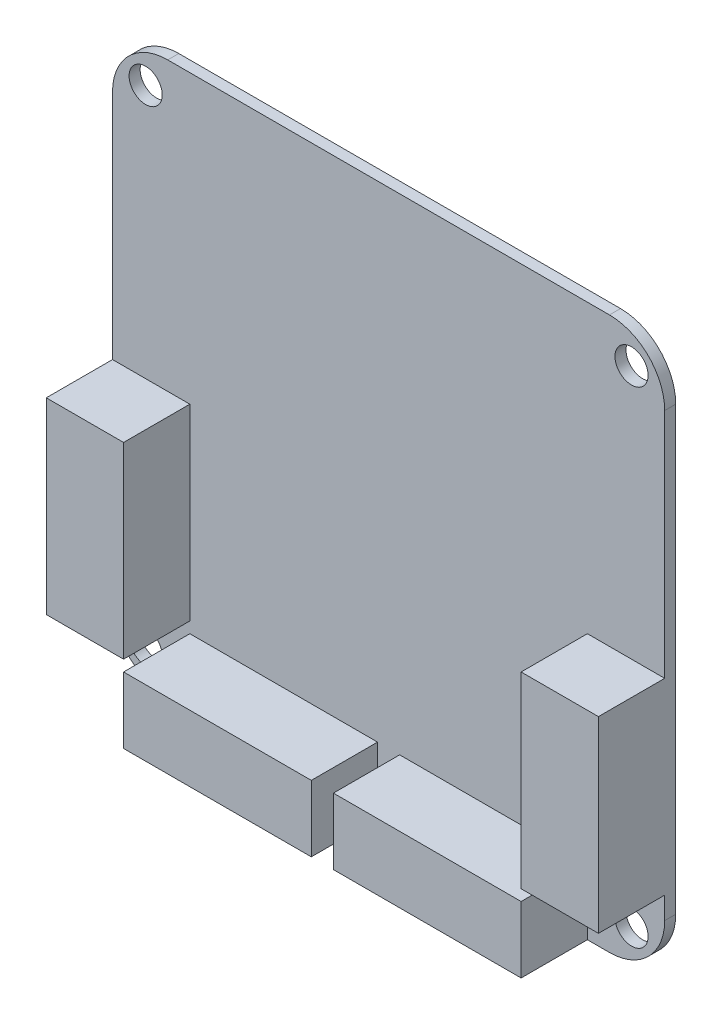
ISO-10303-21;
HEADER;
FILE_DESCRIPTION(('STEP AP214'),'2;1');
FILE_NAME('part.step','',(''),(''),'','','');
FILE_SCHEMA(('AUTOMOTIVE_DESIGN { 1 0 10303 214 1 1 1 1 }'));
ENDSEC;
DATA;
#1=APPLICATION_CONTEXT('core data for automotive mechanical design processes');
#2=APPLICATION_PROTOCOL_DEFINITION('international standard','automotive_design',2000,#1);
#3=PRODUCT_CONTEXT('',#1,'mechanical');
#4=PRODUCT('Part','Part','',(#3));
#5=PRODUCT_RELATED_PRODUCT_CATEGORY('part','',(#4));
#6=PRODUCT_DEFINITION_FORMATION('','',#4);
#7=PRODUCT_DEFINITION_CONTEXT('part definition',#1,'design');
#8=PRODUCT_DEFINITION('design','',#6,#7);
#9=PRODUCT_DEFINITION_SHAPE('','',#8);
#10=(LENGTH_UNIT() NAMED_UNIT(*) SI_UNIT(.MILLI.,.METRE.));
#11=(NAMED_UNIT(*) PLANE_ANGLE_UNIT() SI_UNIT($,.RADIAN.));
#12=(NAMED_UNIT(*) SI_UNIT($,.STERADIAN.) SOLID_ANGLE_UNIT());
#13=UNCERTAINTY_MEASURE_WITH_UNIT(LENGTH_MEASURE(1.E-05),#10,'distance_accuracy_value','');
#14=(GEOMETRIC_REPRESENTATION_CONTEXT(3) GLOBAL_UNCERTAINTY_ASSIGNED_CONTEXT((#13)) GLOBAL_UNIT_ASSIGNED_CONTEXT((#10,
#11,#12)) REPRESENTATION_CONTEXT('',''));
#15=CARTESIAN_POINT('',(0.,0.,0.));
#16=DIRECTION('',(0.,0.,1.));
#17=DIRECTION('',(1.,0.,0.));
#18=AXIS2_PLACEMENT_3D('',#15,#16,#17);
#19=CARTESIAN_POINT('',(0.,0.,1.));
#20=DIRECTION('',(0.,0.,1.));
#21=DIRECTION('',(1.,0.,0.));
#22=AXIS2_PLACEMENT_3D('',#19,#20,#21);
#23=PLANE('',#22);
#24=CARTESIAN_POINT('',(22.,22.,1.));
#25=DIRECTION('',(0.,0.,1.));
#26=DIRECTION('',(1.,0.,0.));
#27=AXIS2_PLACEMENT_3D('',#24,#25,#26);
#28=CIRCLE('',#27,1.5);
#29=CARTESIAN_POINT('',(23.5,22.,1.));
#30=VERTEX_POINT('',#29);
#31=EDGE_CURVE('E818',#30,#30,#28,.T.);
#32=ORIENTED_EDGE('',*,*,#31,.F.);
#33=EDGE_LOOP('',(#32));
#34=FACE_BOUND('',#33,.T.);
#35=CARTESIAN_POINT('',(-22.,-22.,1.));
#36=DIRECTION('',(0.,0.,1.));
#37=DIRECTION('',(1.,0.,0.));
#38=AXIS2_PLACEMENT_3D('',#35,#36,#37);
#39=CIRCLE('',#38,1.5);
#40=CARTESIAN_POINT('',(-20.5,-22.,1.));
#41=VERTEX_POINT('',#40);
#42=EDGE_CURVE('E820',#41,#41,#39,.T.);
#43=ORIENTED_EDGE('',*,*,#42,.F.);
#44=EDGE_LOOP('',(#43));
#45=FACE_BOUND('',#44,.T.);
#46=CARTESIAN_POINT('',(22.,-22.,1.));
#47=DIRECTION('',(0.,0.,1.));
#48=DIRECTION('',(1.,0.,0.));
#49=AXIS2_PLACEMENT_3D('',#46,#47,#48);
#50=CIRCLE('',#49,1.5);
#51=CARTESIAN_POINT('',(23.5,-22.,1.));
#52=VERTEX_POINT('',#51);
#53=EDGE_CURVE('E822',#52,#52,#50,.T.);
#54=ORIENTED_EDGE('',*,*,#53,.F.);
#55=EDGE_LOOP('',(#54));
#56=FACE_BOUND('',#55,.T.);
#57=CARTESIAN_POINT('',(-22.,22.,1.));
#58=DIRECTION('',(0.,0.,1.));
#59=DIRECTION('',(1.,0.,0.));
#60=AXIS2_PLACEMENT_3D('',#57,#58,#59);
#61=CIRCLE('',#60,1.5);
#62=CARTESIAN_POINT('',(-20.5,22.,1.));
#63=VERTEX_POINT('',#62);
#64=EDGE_CURVE('E230',#63,#63,#61,.T.);
#65=ORIENTED_EDGE('',*,*,#64,.F.);
#66=EDGE_LOOP('',(#65));
#67=FACE_BOUND('',#66,.T.);
#68=DIRECTION('',(0.,-1.,0.));
#69=VECTOR('',#68,1.);
#70=CARTESIAN_POINT('',(18.,-18.,1.));
#71=LINE('',#70,#69);
#72=CARTESIAN_POINT('',(18.,-1.00000000000001,1.));
#73=VERTEX_POINT('',#72);
#74=CARTESIAN_POINT('',(18.,-18.,1.));
#75=VERTEX_POINT('',#74);
#76=EDGE_CURVE('E56',#73,#75,#71,.T.);
#77=ORIENTED_EDGE('',*,*,#76,.F.);
#78=DIRECTION('',(-1.,0.,0.));
#79=VECTOR('',#78,1.);
#80=CARTESIAN_POINT('',(25.,-1.00000000000001,1.));
#81=LINE('',#80,#79);
#82=CARTESIAN_POINT('',(25.,-1.00000000000001,1.));
#83=VERTEX_POINT('',#82);
#84=EDGE_CURVE('E214',#83,#73,#81,.T.);
#85=ORIENTED_EDGE('',*,*,#84,.F.);
#86=DIRECTION('',(0.,1.,0.));
#87=VECTOR('',#86,1.);
#88=CARTESIAN_POINT('',(25.,-25.,1.));
#89=LINE('',#88,#87);
#90=CARTESIAN_POINT('',(25.,20.,1.));
#91=VERTEX_POINT('',#90);
#92=EDGE_CURVE('E201',#83,#91,#89,.T.);
#93=ORIENTED_EDGE('',*,*,#92,.T.);
#94=CARTESIAN_POINT('',(20.,20.,1.));
#95=DIRECTION('',(0.,0.,1.));
#96=DIRECTION('',(1.,0.,0.));
#97=AXIS2_PLACEMENT_3D('',#94,#95,#96);
#98=CIRCLE('',#97,5.);
#99=CARTESIAN_POINT('',(20.,25.,1.));
#100=VERTEX_POINT('',#99);
#101=EDGE_CURVE('E375',#91,#100,#98,.T.);
#102=ORIENTED_EDGE('',*,*,#101,.T.);
#103=DIRECTION('',(-1.,0.,0.));
#104=VECTOR('',#103,1.);
#105=CARTESIAN_POINT('',(25.,25.,1.));
#106=LINE('',#105,#104);
#107=CARTESIAN_POINT('',(-20.,25.,1.));
#108=VERTEX_POINT('',#107);
#109=EDGE_CURVE('E340',#100,#108,#106,.T.);
#110=ORIENTED_EDGE('',*,*,#109,.T.);
#111=CARTESIAN_POINT('',(-20.,20.,1.));
#112=DIRECTION('',(0.,0.,1.));
#113=DIRECTION('',(1.,0.,0.));
#114=AXIS2_PLACEMENT_3D('',#111,#112,#113);
#115=CIRCLE('',#114,5.);
#116=CARTESIAN_POINT('',(-25.,20.,1.));
#117=VERTEX_POINT('',#116);
#118=EDGE_CURVE('E373',#108,#117,#115,.T.);
#119=ORIENTED_EDGE('',*,*,#118,.T.);
#120=DIRECTION('',(0.,-1.,0.));
#121=VECTOR('',#120,1.);
#122=CARTESIAN_POINT('',(-25.,-25.,1.));
#123=LINE('',#122,#121);
#124=CARTESIAN_POINT('',(-25.,-1.00000000000001,1.));
#125=VERTEX_POINT('',#124);
#126=EDGE_CURVE('E333',#117,#125,#123,.T.);
#127=ORIENTED_EDGE('',*,*,#126,.T.);
#128=DIRECTION('',(-1.,0.,0.));
#129=VECTOR('',#128,1.);
#130=CARTESIAN_POINT('',(-25.,-1.00000000000001,1.));
#131=LINE('',#130,#129);
#132=CARTESIAN_POINT('',(-18.,-1.00000000000001,1.));
#133=VERTEX_POINT('',#132);
#134=EDGE_CURVE('E287',#133,#125,#131,.T.);
#135=ORIENTED_EDGE('',*,*,#134,.F.);
#136=DIRECTION('',(0.,1.,0.));
#137=VECTOR('',#136,1.);
#138=CARTESIAN_POINT('',(-18.,-18.,1.));
#139=LINE('',#138,#137);
#140=CARTESIAN_POINT('',(-18.,-18.,1.));
#141=VERTEX_POINT('',#140);
#142=EDGE_CURVE('E289',#141,#133,#139,.T.);
#143=ORIENTED_EDGE('',*,*,#142,.F.);
#144=DIRECTION('',(1.,0.,0.));
#145=VECTOR('',#144,1.);
#146=CARTESIAN_POINT('',(-25.,-18.,1.));
#147=LINE('',#146,#145);
#148=CARTESIAN_POINT('',(-25.,-18.,1.));
#149=VERTEX_POINT('',#148);
#150=EDGE_CURVE('E293',#149,#141,#147,.T.);
#151=ORIENTED_EDGE('',*,*,#150,.F.);
#152=CARTESIAN_POINT('',(-25.,-20.,1.));
#153=VERTEX_POINT('',#152);
#154=EDGE_CURVE('E337',#149,#153,#123,.T.);
#155=ORIENTED_EDGE('',*,*,#154,.T.);
#156=CARTESIAN_POINT('',(-20.,-20.,1.));
#157=DIRECTION('',(0.,0.,1.));
#158=DIRECTION('',(1.,0.,0.));
#159=AXIS2_PLACEMENT_3D('',#156,#157,#158);
#160=CIRCLE('',#159,5.);
#161=CARTESIAN_POINT('',(-20.,-25.,1.));
#162=VERTEX_POINT('',#161);
#163=EDGE_CURVE('E379',#153,#162,#160,.T.);
#164=ORIENTED_EDGE('',*,*,#163,.T.);
#165=DIRECTION('',(1.,0.,0.));
#166=VECTOR('',#165,1.);
#167=CARTESIAN_POINT('',(25.,-25.,1.));
#168=LINE('',#167,#166);
#169=CARTESIAN_POINT('',(-18.,-25.,1.));
#170=VERTEX_POINT('',#169);
#171=EDGE_CURVE('E212',#162,#170,#168,.T.);
#172=ORIENTED_EDGE('',*,*,#171,.T.);
#173=DIRECTION('',(0.,-1.,0.));
#174=VECTOR('',#173,1.);
#175=CARTESIAN_POINT('',(-18.,-25.,1.));
#176=LINE('',#175,#174);
#177=CARTESIAN_POINT('',(-18.,-19.,1.));
#178=VERTEX_POINT('',#177);
#179=EDGE_CURVE('E307',#178,#170,#176,.T.);
#180=ORIENTED_EDGE('',*,*,#179,.F.);
#181=DIRECTION('',(-1.,0.,0.));
#182=VECTOR('',#181,1.);
#183=CARTESIAN_POINT('',(-0.999999999999997,-19.,1.));
#184=LINE('',#183,#182);
#185=CARTESIAN_POINT('',(-0.999999999999997,-19.,1.));
#186=VERTEX_POINT('',#185);
#187=EDGE_CURVE('E316',#186,#178,#184,.T.);
#188=ORIENTED_EDGE('',*,*,#187,.F.);
#189=DIRECTION('',(0.,1.,0.));
#190=VECTOR('',#189,1.);
#191=CARTESIAN_POINT('',(-0.999999999999997,-25.,1.));
#192=LINE('',#191,#190);
#193=CARTESIAN_POINT('',(-0.999999999999997,-25.,1.));
#194=VERTEX_POINT('',#193);
#195=EDGE_CURVE('E295',#194,#186,#192,.T.);
#196=ORIENTED_EDGE('',*,*,#195,.F.);
#197=CARTESIAN_POINT('',(1.,-25.,1.));
#198=VERTEX_POINT('',#197);
#199=EDGE_CURVE('E338',#194,#198,#168,.T.);
#200=ORIENTED_EDGE('',*,*,#199,.T.);
#201=DIRECTION('',(0.,-1.,0.));
#202=VECTOR('',#201,1.);
#203=CARTESIAN_POINT('',(1.,-25.,1.));
#204=LINE('',#203,#202);
#205=CARTESIAN_POINT('',(1.00000000000001,-19.,1.));
#206=VERTEX_POINT('',#205);
#207=EDGE_CURVE('E266',#206,#198,#204,.T.);
#208=ORIENTED_EDGE('',*,*,#207,.F.);
#209=DIRECTION('',(-1.,0.,0.));
#210=VECTOR('',#209,1.);
#211=CARTESIAN_POINT('',(1.00000000000001,-19.,1.));
#212=LINE('',#211,#210);
#213=CARTESIAN_POINT('',(18.,-19.,1.));
#214=VERTEX_POINT('',#213);
#215=EDGE_CURVE('E259',#214,#206,#212,.T.);
#216=ORIENTED_EDGE('',*,*,#215,.F.);
#217=DIRECTION('',(0.,1.,0.));
#218=VECTOR('',#217,1.);
#219=CARTESIAN_POINT('',(18.,-25.,1.));
#220=LINE('',#219,#218);
#221=CARTESIAN_POINT('',(18.,-25.,1.));
#222=VERTEX_POINT('',#221);
#223=EDGE_CURVE('E262',#222,#214,#220,.T.);
#224=ORIENTED_EDGE('',*,*,#223,.F.);
#225=CARTESIAN_POINT('',(20.,-25.,1.));
#226=VERTEX_POINT('',#225);
#227=EDGE_CURVE('E336',#222,#226,#168,.T.);
#228=ORIENTED_EDGE('',*,*,#227,.T.);
#229=CARTESIAN_POINT('',(20.,-20.,1.));
#230=DIRECTION('',(0.,0.,1.));
#231=DIRECTION('',(1.,0.,0.));
#232=AXIS2_PLACEMENT_3D('',#229,#230,#231);
#233=CIRCLE('',#232,5.);
#234=CARTESIAN_POINT('',(25.,-20.,1.));
#235=VERTEX_POINT('',#234);
#236=EDGE_CURVE('E377',#226,#235,#233,.T.);
#237=ORIENTED_EDGE('',*,*,#236,.T.);
#238=CARTESIAN_POINT('',(25.,-18.,1.));
#239=VERTEX_POINT('',#238);
#240=EDGE_CURVE('E211',#235,#239,#89,.T.);
#241=ORIENTED_EDGE('',*,*,#240,.T.);
#242=DIRECTION('',(1.,0.,0.));
#243=VECTOR('',#242,1.);
#244=CARTESIAN_POINT('',(25.,-18.,1.));
#245=LINE('',#244,#243);
#246=EDGE_CURVE('E61',#75,#239,#245,.T.);
#247=ORIENTED_EDGE('',*,*,#246,.F.);
#248=EDGE_LOOP('',(#77,#85,#93,#102,#110,#119,#127,#135,#143,#151,#155,#164,#172,#180,#188,#196,
#200,#208,#216,#224,#228,#237,#241,#247));
#249=FACE_BOUND('',#248,.T.);
#250=ADVANCED_FACE('F39',(#34,#45,#56,#67,#249),#23,.T.);
#251=CARTESIAN_POINT('',(-25.,-25.,1.));
#252=DIRECTION('',(1.,0.,0.));
#253=DIRECTION('',(0.,0.,-1.));
#254=AXIS2_PLACEMENT_3D('',#251,#252,#253);
#255=PLANE('',#254);
#256=DIRECTION('',(0.,-1.,0.));
#257=VECTOR('',#256,1.);
#258=CARTESIAN_POINT('',(-25.,-25.,0.));
#259=LINE('',#258,#257);
#260=CARTESIAN_POINT('',(-25.,20.,0.));
#261=VERTEX_POINT('',#260);
#262=CARTESIAN_POINT('',(-25.,-20.,0.));
#263=VERTEX_POINT('',#262);
#264=EDGE_CURVE('E332',#261,#263,#259,.T.);
#265=ORIENTED_EDGE('',*,*,#264,.T.);
#266=DIRECTION('',(0.,0.,-1.));
#267=VECTOR('',#266,1.);
#268=CARTESIAN_POINT('',(-25.,-20.,1.));
#269=LINE('',#268,#267);
#270=EDGE_CURVE('E370',#263,#153,#269,.F.);
#271=ORIENTED_EDGE('',*,*,#270,.T.);
#272=ORIENTED_EDGE('',*,*,#154,.F.);
#273=DIRECTION('',(0.,0.,-1.));
#274=VECTOR('',#273,1.);
#275=CARTESIAN_POINT('',(-25.,-18.,7.));
#276=LINE('',#275,#274);
#277=CARTESIAN_POINT('',(-25.,-18.,7.));
#278=VERTEX_POINT('',#277);
#279=EDGE_CURVE('E269',#278,#149,#276,.T.);
#280=ORIENTED_EDGE('',*,*,#279,.F.);
#281=DIRECTION('',(0.,-1.,0.));
#282=VECTOR('',#281,1.);
#283=CARTESIAN_POINT('',(-25.,-18.,7.));
#284=LINE('',#283,#282);
#285=CARTESIAN_POINT('',(-25.,-1.00000000000001,7.));
#286=VERTEX_POINT('',#285);
#287=EDGE_CURVE('E290',#286,#278,#284,.T.);
#288=ORIENTED_EDGE('',*,*,#287,.F.);
#289=DIRECTION('',(0.,0.,-1.));
#290=VECTOR('',#289,1.);
#291=CARTESIAN_POINT('',(-25.,-1.00000000000001,7.));
#292=LINE('',#291,#290);
#293=EDGE_CURVE('E283',#286,#125,#292,.T.);
#294=ORIENTED_EDGE('',*,*,#293,.T.);
#295=ORIENTED_EDGE('',*,*,#126,.F.);
#296=DIRECTION('',(0.,0.,-1.));
#297=VECTOR('',#296,1.);
#298=CARTESIAN_POINT('',(-25.,20.,1.));
#299=LINE('',#298,#297);
#300=EDGE_CURVE('E367',#117,#261,#299,.T.);
#301=ORIENTED_EDGE('',*,*,#300,.T.);
#302=EDGE_LOOP('',(#265,#271,#272,#280,#288,#294,#295,#301));
#303=FACE_BOUND('',#302,.T.);
#304=ADVANCED_FACE('F415',(#303),#255,.F.);
#305=CARTESIAN_POINT('',(25.,-25.,1.));
#306=DIRECTION('',(0.,1.,0.));
#307=DIRECTION('',(-1.,0.,0.));
#308=AXIS2_PLACEMENT_3D('',#305,#306,#307);
#309=PLANE('',#308);
#310=ORIENTED_EDGE('',*,*,#171,.F.);
#311=DIRECTION('',(0.,0.,-1.));
#312=VECTOR('',#311,1.);
#313=CARTESIAN_POINT('',(-20.,-25.,1.));
#314=LINE('',#313,#312);
#315=CARTESIAN_POINT('',(-20.,-25.,0.));
#316=VERTEX_POINT('',#315);
#317=EDGE_CURVE('E356',#162,#316,#314,.T.);
#318=ORIENTED_EDGE('',*,*,#317,.T.);
#319=DIRECTION('',(1.,0.,0.));
#320=VECTOR('',#319,1.);
#321=CARTESIAN_POINT('',(25.,-25.,0.));
#322=LINE('',#321,#320);
#323=CARTESIAN_POINT('',(20.,-25.,0.));
#324=VERTEX_POINT('',#323);
#325=EDGE_CURVE('E346',#316,#324,#322,.T.);
#326=ORIENTED_EDGE('',*,*,#325,.T.);
#327=DIRECTION('',(0.,0.,-1.));
#328=VECTOR('',#327,1.);
#329=CARTESIAN_POINT('',(20.,-25.,1.));
#330=LINE('',#329,#328);
#331=EDGE_CURVE('E343',#324,#226,#330,.F.);
#332=ORIENTED_EDGE('',*,*,#331,.T.);
#333=ORIENTED_EDGE('',*,*,#227,.F.);
#334=DIRECTION('',(0.,0.,-1.));
#335=VECTOR('',#334,1.);
#336=CARTESIAN_POINT('',(18.,-25.,7.));
#337=LINE('',#336,#335);
#338=CARTESIAN_POINT('',(18.,-25.,7.));
#339=VERTEX_POINT('',#338);
#340=EDGE_CURVE('E249',#339,#222,#337,.T.);
#341=ORIENTED_EDGE('',*,*,#340,.F.);
#342=DIRECTION('',(1.,0.,0.));
#343=VECTOR('',#342,1.);
#344=CARTESIAN_POINT('',(1.,-25.,7.));
#345=LINE('',#344,#343);
#346=CARTESIAN_POINT('',(1.,-25.,7.));
#347=VERTEX_POINT('',#346);
#348=EDGE_CURVE('E273',#347,#339,#345,.T.);
#349=ORIENTED_EDGE('',*,*,#348,.F.);
#350=DIRECTION('',(0.,0.,-1.));
#351=VECTOR('',#350,1.);
#352=CARTESIAN_POINT('',(1.,-25.,7.));
#353=LINE('',#352,#351);
#354=EDGE_CURVE('E218',#347,#198,#353,.T.);
#355=ORIENTED_EDGE('',*,*,#354,.T.);
#356=ORIENTED_EDGE('',*,*,#199,.F.);
#357=DIRECTION('',(0.,0.,-1.));
#358=VECTOR('',#357,1.);
#359=CARTESIAN_POINT('',(-0.999999999999997,-25.,7.));
#360=LINE('',#359,#358);
#361=CARTESIAN_POINT('',(-0.999999999999997,-25.,7.));
#362=VERTEX_POINT('',#361);
#363=EDGE_CURVE('E313',#362,#194,#360,.T.);
#364=ORIENTED_EDGE('',*,*,#363,.F.);
#365=DIRECTION('',(1.,0.,0.));
#366=VECTOR('',#365,1.);
#367=CARTESIAN_POINT('',(-0.999999999999997,-25.,7.));
#368=LINE('',#367,#366);
#369=CARTESIAN_POINT('',(-18.,-25.,7.));
#370=VERTEX_POINT('',#369);
#371=EDGE_CURVE('E311',#370,#362,#368,.T.);
#372=ORIENTED_EDGE('',*,*,#371,.F.);
#373=DIRECTION('',(0.,0.,-1.));
#374=VECTOR('',#373,1.);
#375=CARTESIAN_POINT('',(-18.,-25.,7.));
#376=LINE('',#375,#374);
#377=EDGE_CURVE('E323',#370,#170,#376,.T.);
#378=ORIENTED_EDGE('',*,*,#377,.T.);
#379=EDGE_LOOP('',(#310,#318,#326,#332,#333,#341,#349,#355,#356,#364,#372,#378));
#380=FACE_BOUND('',#379,.T.);
#381=ADVANCED_FACE('F423',(#380),#309,.F.);
#382=CARTESIAN_POINT('',(25.,-25.,1.));
#383=DIRECTION('',(-1.,0.,0.));
#384=DIRECTION('',(0.,0.,1.));
#385=AXIS2_PLACEMENT_3D('',#382,#383,#384);
#386=PLANE('',#385);
#387=ORIENTED_EDGE('',*,*,#240,.F.);
#388=DIRECTION('',(0.,0.,-1.));
#389=VECTOR('',#388,1.);
#390=CARTESIAN_POINT('',(25.,-20.,1.));
#391=LINE('',#390,#389);
#392=CARTESIAN_POINT('',(25.,-20.,0.));
#393=VERTEX_POINT('',#392);
#394=EDGE_CURVE('E382',#235,#393,#391,.T.);
#395=ORIENTED_EDGE('',*,*,#394,.T.);
#396=DIRECTION('',(0.,1.,0.));
#397=VECTOR('',#396,1.);
#398=CARTESIAN_POINT('',(25.,-25.,0.));
#399=LINE('',#398,#397);
#400=CARTESIAN_POINT('',(25.,20.,0.));
#401=VERTEX_POINT('',#400);
#402=EDGE_CURVE('E349',#393,#401,#399,.T.);
#403=ORIENTED_EDGE('',*,*,#402,.T.);
#404=DIRECTION('',(0.,0.,-1.));
#405=VECTOR('',#404,1.);
#406=CARTESIAN_POINT('',(25.,20.,1.));
#407=LINE('',#406,#405);
#408=EDGE_CURVE('E209',#401,#91,#407,.F.);
#409=ORIENTED_EDGE('',*,*,#408,.T.);
#410=ORIENTED_EDGE('',*,*,#92,.F.);
#411=DIRECTION('',(0.,0.,-1.));
#412=VECTOR('',#411,1.);
#413=CARTESIAN_POINT('',(25.,-1.00000000000001,7.));
#414=LINE('',#413,#412);
#415=CARTESIAN_POINT('',(25.,-1.00000000000001,7.));
#416=VERTEX_POINT('',#415);
#417=EDGE_CURVE('E206',#416,#83,#414,.T.);
#418=ORIENTED_EDGE('',*,*,#417,.F.);
#419=DIRECTION('',(0.,1.,0.));
#420=VECTOR('',#419,1.);
#421=CARTESIAN_POINT('',(25.,-18.,7.));
#422=LINE('',#421,#420);
#423=CARTESIAN_POINT('',(25.,-18.,7.));
#424=VERTEX_POINT('',#423);
#425=EDGE_CURVE('E240',#424,#416,#422,.T.);
#426=ORIENTED_EDGE('',*,*,#425,.F.);
#427=DIRECTION('',(0.,0.,-1.));
#428=VECTOR('',#427,1.);
#429=CARTESIAN_POINT('',(25.,-18.,7.));
#430=LINE('',#429,#428);
#431=EDGE_CURVE('E235',#424,#239,#430,.T.);
#432=ORIENTED_EDGE('',*,*,#431,.T.);
#433=EDGE_LOOP('',(#387,#395,#403,#409,#410,#418,#426,#432));
#434=FACE_BOUND('',#433,.T.);
#435=ADVANCED_FACE('F203',(#434),#386,.F.);
#436=CARTESIAN_POINT('',(25.,25.,1.));
#437=DIRECTION('',(0.,-1.,0.));
#438=DIRECTION('',(1.,0.,0.));
#439=AXIS2_PLACEMENT_3D('',#436,#437,#438);
#440=PLANE('',#439);
#441=ORIENTED_EDGE('',*,*,#109,.F.);
#442=DIRECTION('',(0.,0.,-1.));
#443=VECTOR('',#442,1.);
#444=CARTESIAN_POINT('',(20.,25.,1.));
#445=LINE('',#444,#443);
#446=CARTESIAN_POINT('',(20.,25.,0.));
#447=VERTEX_POINT('',#446);
#448=EDGE_CURVE('E11',#100,#447,#445,.T.);
#449=ORIENTED_EDGE('',*,*,#448,.T.);
#450=DIRECTION('',(-1.,0.,0.));
#451=VECTOR('',#450,1.);
#452=CARTESIAN_POINT('',(25.,25.,0.));
#453=LINE('',#452,#451);
#454=CARTESIAN_POINT('',(-20.,25.,0.));
#455=VERTEX_POINT('',#454);
#456=EDGE_CURVE('E351',#447,#455,#453,.T.);
#457=ORIENTED_EDGE('',*,*,#456,.T.);
#458=DIRECTION('',(0.,0.,-1.));
#459=VECTOR('',#458,1.);
#460=CARTESIAN_POINT('',(-20.,25.,1.));
#461=LINE('',#460,#459);
#462=EDGE_CURVE('E48',#455,#108,#461,.F.);
#463=ORIENTED_EDGE('',*,*,#462,.T.);
#464=EDGE_LOOP('',(#441,#449,#457,#463));
#465=FACE_BOUND('',#464,.T.);
#466=ADVANCED_FACE('F434',(#465),#440,.F.);
#467=CARTESIAN_POINT('',(0.,0.,0.));
#468=DIRECTION('',(0.,0.,1.));
#469=DIRECTION('',(1.,0.,0.));
#470=AXIS2_PLACEMENT_3D('',#467,#468,#469);
#471=PLANE('',#470);
#472=CARTESIAN_POINT('',(22.,22.,0.));
#473=DIRECTION('',(0.,0.,1.));
#474=DIRECTION('',(1.,0.,0.));
#475=AXIS2_PLACEMENT_3D('',#472,#473,#474);
#476=CIRCLE('',#475,1.5);
#477=CARTESIAN_POINT('',(23.5,22.,0.));
#478=VERTEX_POINT('',#477);
#479=EDGE_CURVE('E43',#478,#478,#476,.T.);
#480=ORIENTED_EDGE('',*,*,#479,.T.);
#481=EDGE_LOOP('',(#480));
#482=FACE_BOUND('',#481,.T.);
#483=CARTESIAN_POINT('',(-22.,-22.,0.));
#484=DIRECTION('',(0.,0.,1.));
#485=DIRECTION('',(1.,0.,0.));
#486=AXIS2_PLACEMENT_3D('',#483,#484,#485);
#487=CIRCLE('',#486,1.5);
#488=CARTESIAN_POINT('',(-20.5,-22.,0.));
#489=VERTEX_POINT('',#488);
#490=EDGE_CURVE('E228',#489,#489,#487,.T.);
#491=ORIENTED_EDGE('',*,*,#490,.T.);
#492=EDGE_LOOP('',(#491));
#493=FACE_BOUND('',#492,.T.);
#494=CARTESIAN_POINT('',(22.,-22.,0.));
#495=DIRECTION('',(0.,0.,1.));
#496=DIRECTION('',(1.,0.,0.));
#497=AXIS2_PLACEMENT_3D('',#494,#495,#496);
#498=CIRCLE('',#497,1.5);
#499=CARTESIAN_POINT('',(23.5,-22.,0.));
#500=VERTEX_POINT('',#499);
#501=EDGE_CURVE('E389',#500,#500,#498,.T.);
#502=ORIENTED_EDGE('',*,*,#501,.T.);
#503=EDGE_LOOP('',(#502));
#504=FACE_BOUND('',#503,.T.);
#505=CARTESIAN_POINT('',(-22.,22.,0.));
#506=DIRECTION('',(0.,0.,1.));
#507=DIRECTION('',(1.,0.,0.));
#508=AXIS2_PLACEMENT_3D('',#505,#506,#507);
#509=CIRCLE('',#508,1.5);
#510=CARTESIAN_POINT('',(-20.5,22.,0.));
#511=VERTEX_POINT('',#510);
#512=EDGE_CURVE('E386',#511,#511,#509,.T.);
#513=ORIENTED_EDGE('',*,*,#512,.T.);
#514=EDGE_LOOP('',(#513));
#515=FACE_BOUND('',#514,.T.);
#516=ORIENTED_EDGE('',*,*,#325,.F.);
#517=CARTESIAN_POINT('',(-20.,-20.,0.));
#518=DIRECTION('',(0.,0.,1.));
#519=DIRECTION('',(1.,0.,0.));
#520=AXIS2_PLACEMENT_3D('',#517,#518,#519);
#521=CIRCLE('',#520,5.);
#522=EDGE_CURVE('E365',#316,#263,#521,.F.);
#523=ORIENTED_EDGE('',*,*,#522,.T.);
#524=ORIENTED_EDGE('',*,*,#264,.F.);
#525=CARTESIAN_POINT('',(-20.,20.,0.));
#526=DIRECTION('',(0.,0.,1.));
#527=DIRECTION('',(1.,0.,0.));
#528=AXIS2_PLACEMENT_3D('',#525,#526,#527);
#529=CIRCLE('',#528,5.);
#530=EDGE_CURVE('E359',#261,#455,#529,.F.);
#531=ORIENTED_EDGE('',*,*,#530,.T.);
#532=ORIENTED_EDGE('',*,*,#456,.F.);
#533=CARTESIAN_POINT('',(20.,20.,0.));
#534=DIRECTION('',(0.,0.,1.));
#535=DIRECTION('',(1.,0.,0.));
#536=AXIS2_PLACEMENT_3D('',#533,#534,#535);
#537=CIRCLE('',#536,5.);
#538=EDGE_CURVE('E361',#447,#401,#537,.F.);
#539=ORIENTED_EDGE('',*,*,#538,.T.);
#540=ORIENTED_EDGE('',*,*,#402,.F.);
#541=CARTESIAN_POINT('',(20.,-20.,0.));
#542=DIRECTION('',(0.,0.,1.));
#543=DIRECTION('',(1.,0.,0.));
#544=AXIS2_PLACEMENT_3D('',#541,#542,#543);
#545=CIRCLE('',#544,5.);
#546=EDGE_CURVE('E363',#393,#324,#545,.F.);
#547=ORIENTED_EDGE('',*,*,#546,.T.);
#548=EDGE_LOOP('',(#516,#523,#524,#531,#532,#539,#540,#547));
#549=FACE_BOUND('',#548,.T.);
#550=ADVANCED_FACE('F394',(#482,#493,#504,#515,#549),#471,.F.);
#551=CARTESIAN_POINT('',(-20.,-20.,1.));
#552=DIRECTION('',(0.,0.,-1.));
#553=DIRECTION('',(-1.,0.,0.));
#554=AXIS2_PLACEMENT_3D('',#551,#552,#553);
#555=CYLINDRICAL_SURFACE('',#554,5.);
#556=ORIENTED_EDGE('',*,*,#163,.F.);
#557=ORIENTED_EDGE('',*,*,#270,.F.);
#558=ORIENTED_EDGE('',*,*,#522,.F.);
#559=ORIENTED_EDGE('',*,*,#317,.F.);
#560=EDGE_LOOP('',(#556,#557,#558,#559));
#561=FACE_BOUND('',#560,.T.);
#562=ADVANCED_FACE('F433',(#561),#555,.T.);
#563=CARTESIAN_POINT('',(20.,-20.,1.));
#564=DIRECTION('',(0.,0.,-1.));
#565=DIRECTION('',(-1.,0.,0.));
#566=AXIS2_PLACEMENT_3D('',#563,#564,#565);
#567=CYLINDRICAL_SURFACE('',#566,5.);
#568=ORIENTED_EDGE('',*,*,#236,.F.);
#569=ORIENTED_EDGE('',*,*,#331,.F.);
#570=ORIENTED_EDGE('',*,*,#546,.F.);
#571=ORIENTED_EDGE('',*,*,#394,.F.);
#572=EDGE_LOOP('',(#568,#569,#570,#571));
#573=FACE_BOUND('',#572,.T.);
#574=ADVANCED_FACE('F446',(#573),#567,.T.);
#575=CARTESIAN_POINT('',(20.,20.,1.));
#576=DIRECTION('',(0.,0.,-1.));
#577=DIRECTION('',(-1.,0.,0.));
#578=AXIS2_PLACEMENT_3D('',#575,#576,#577);
#579=CYLINDRICAL_SURFACE('',#578,5.);
#580=ORIENTED_EDGE('',*,*,#101,.F.);
#581=ORIENTED_EDGE('',*,*,#408,.F.);
#582=ORIENTED_EDGE('',*,*,#538,.F.);
#583=ORIENTED_EDGE('',*,*,#448,.F.);
#584=EDGE_LOOP('',(#580,#581,#582,#583));
#585=FACE_BOUND('',#584,.T.);
#586=ADVANCED_FACE('F449',(#585),#579,.T.);
#587=CARTESIAN_POINT('',(-20.,20.,1.));
#588=DIRECTION('',(0.,0.,-1.));
#589=DIRECTION('',(-1.,0.,0.));
#590=AXIS2_PLACEMENT_3D('',#587,#588,#589);
#591=CYLINDRICAL_SURFACE('',#590,5.);
#592=ORIENTED_EDGE('',*,*,#118,.F.);
#593=ORIENTED_EDGE('',*,*,#462,.F.);
#594=ORIENTED_EDGE('',*,*,#530,.F.);
#595=ORIENTED_EDGE('',*,*,#300,.F.);
#596=EDGE_LOOP('',(#592,#593,#594,#595));
#597=FACE_BOUND('',#596,.T.);
#598=ADVANCED_FACE('F41',(#597),#591,.T.);
#599=CARTESIAN_POINT('',(-0.999999999999997,-25.,7.));
#600=DIRECTION('',(-1.,0.,0.));
#601=DIRECTION('',(0.,0.,1.));
#602=AXIS2_PLACEMENT_3D('',#599,#600,#601);
#603=PLANE('',#602);
#604=ORIENTED_EDGE('',*,*,#195,.T.);
#605=DIRECTION('',(0.,0.,-1.));
#606=VECTOR('',#605,1.);
#607=CARTESIAN_POINT('',(-0.999999999999997,-19.,7.));
#608=LINE('',#607,#606);
#609=CARTESIAN_POINT('',(-0.999999999999997,-19.,7.));
#610=VERTEX_POINT('',#609);
#611=EDGE_CURVE('E329',#610,#186,#608,.T.);
#612=ORIENTED_EDGE('',*,*,#611,.F.);
#613=DIRECTION('',(0.,1.,0.));
#614=VECTOR('',#613,1.);
#615=CARTESIAN_POINT('',(-0.999999999999997,-25.,7.));
#616=LINE('',#615,#614);
#617=EDGE_CURVE('E303',#362,#610,#616,.T.);
#618=ORIENTED_EDGE('',*,*,#617,.F.);
#619=ORIENTED_EDGE('',*,*,#363,.T.);
#620=EDGE_LOOP('',(#604,#612,#618,#619));
#621=FACE_BOUND('',#620,.T.);
#622=ADVANCED_FACE('F430',(#621),#603,.F.);
#623=CARTESIAN_POINT('',(-0.999999999999997,-19.,7.));
#624=DIRECTION('',(0.,-1.,0.));
#625=DIRECTION('',(1.,0.,0.));
#626=AXIS2_PLACEMENT_3D('',#623,#624,#625);
#627=PLANE('',#626);
#628=ORIENTED_EDGE('',*,*,#187,.T.);
#629=DIRECTION('',(0.,0.,-1.));
#630=VECTOR('',#629,1.);
#631=CARTESIAN_POINT('',(-18.,-19.,7.));
#632=LINE('',#631,#630);
#633=CARTESIAN_POINT('',(-18.,-19.,7.));
#634=VERTEX_POINT('',#633);
#635=EDGE_CURVE('E326',#634,#178,#632,.T.);
#636=ORIENTED_EDGE('',*,*,#635,.F.);
#637=DIRECTION('',(-1.,0.,0.));
#638=VECTOR('',#637,1.);
#639=CARTESIAN_POINT('',(-0.999999999999997,-19.,7.));
#640=LINE('',#639,#638);
#641=EDGE_CURVE('E306',#610,#634,#640,.T.);
#642=ORIENTED_EDGE('',*,*,#641,.F.);
#643=ORIENTED_EDGE('',*,*,#611,.T.);
#644=EDGE_LOOP('',(#628,#636,#642,#643));
#645=FACE_BOUND('',#644,.T.);
#646=ADVANCED_FACE('F546',(#645),#627,.F.);
#647=CARTESIAN_POINT('',(-18.,-25.,7.));
#648=DIRECTION('',(1.,0.,0.));
#649=DIRECTION('',(0.,0.,-1.));
#650=AXIS2_PLACEMENT_3D('',#647,#648,#649);
#651=PLANE('',#650);
#652=ORIENTED_EDGE('',*,*,#179,.T.);
#653=ORIENTED_EDGE('',*,*,#377,.F.);
#654=DIRECTION('',(0.,-1.,0.));
#655=VECTOR('',#654,1.);
#656=CARTESIAN_POINT('',(-18.,-25.,7.));
#657=LINE('',#656,#655);
#658=EDGE_CURVE('E309',#634,#370,#657,.T.);
#659=ORIENTED_EDGE('',*,*,#658,.F.);
#660=ORIENTED_EDGE('',*,*,#635,.T.);
#661=EDGE_LOOP('',(#652,#653,#659,#660));
#662=FACE_BOUND('',#661,.T.);
#663=ADVANCED_FACE('F543',(#662),#651,.F.);
#664=CARTESIAN_POINT('',(0.,0.,7.));
#665=DIRECTION('',(0.,0.,1.));
#666=DIRECTION('',(1.,0.,0.));
#667=AXIS2_PLACEMENT_3D('',#664,#665,#666);
#668=PLANE('',#667);
#669=ORIENTED_EDGE('',*,*,#617,.T.);
#670=ORIENTED_EDGE('',*,*,#641,.T.);
#671=ORIENTED_EDGE('',*,*,#658,.T.);
#672=ORIENTED_EDGE('',*,*,#371,.T.);
#673=EDGE_LOOP('',(#669,#670,#671,#672));
#674=FACE_BOUND('',#673,.T.);
#675=ADVANCED_FACE('F533',(#674),#668,.T.);
#676=CARTESIAN_POINT('',(-25.,-18.,7.));
#677=DIRECTION('',(0.,1.,0.));
#678=DIRECTION('',(0.,0.,1.));
#679=AXIS2_PLACEMENT_3D('',#676,#677,#678);
#680=PLANE('',#679);
#681=ORIENTED_EDGE('',*,*,#150,.T.);
#682=DIRECTION('',(0.,0.,-1.));
#683=VECTOR('',#682,1.);
#684=CARTESIAN_POINT('',(-18.,-18.,7.));
#685=LINE('',#684,#683);
#686=CARTESIAN_POINT('',(-18.,-18.,7.));
#687=VERTEX_POINT('',#686);
#688=EDGE_CURVE('E278',#687,#141,#685,.T.);
#689=ORIENTED_EDGE('',*,*,#688,.F.);
#690=DIRECTION('',(1.,0.,0.));
#691=VECTOR('',#690,1.);
#692=CARTESIAN_POINT('',(-25.,-18.,7.));
#693=LINE('',#692,#691);
#694=EDGE_CURVE('E299',#278,#687,#693,.T.);
#695=ORIENTED_EDGE('',*,*,#694,.F.);
#696=ORIENTED_EDGE('',*,*,#279,.T.);
#697=EDGE_LOOP('',(#681,#689,#695,#696));
#698=FACE_BOUND('',#697,.T.);
#699=ADVANCED_FACE('F481',(#698),#680,.F.);
#700=CARTESIAN_POINT('',(-18.,-18.,7.));
#701=DIRECTION('',(-1.,0.,0.));
#702=DIRECTION('',(0.,0.,1.));
#703=AXIS2_PLACEMENT_3D('',#700,#701,#702);
#704=PLANE('',#703);
#705=ORIENTED_EDGE('',*,*,#142,.T.);
#706=DIRECTION('',(0.,0.,-1.));
#707=VECTOR('',#706,1.);
#708=CARTESIAN_POINT('',(-18.,-1.00000000000001,7.));
#709=LINE('',#708,#707);
#710=CARTESIAN_POINT('',(-18.,-1.00000000000001,7.));
#711=VERTEX_POINT('',#710);
#712=EDGE_CURVE('E281',#711,#133,#709,.T.);
#713=ORIENTED_EDGE('',*,*,#712,.F.);
#714=DIRECTION('',(0.,1.,0.));
#715=VECTOR('',#714,1.);
#716=CARTESIAN_POINT('',(-18.,-18.,7.));
#717=LINE('',#716,#715);
#718=EDGE_CURVE('E297',#687,#711,#717,.T.);
#719=ORIENTED_EDGE('',*,*,#718,.F.);
#720=ORIENTED_EDGE('',*,*,#688,.T.);
#721=EDGE_LOOP('',(#705,#713,#719,#720));
#722=FACE_BOUND('',#721,.T.);
#723=ADVANCED_FACE('F477',(#722),#704,.F.);
#724=CARTESIAN_POINT('',(-25.,-1.00000000000001,7.));
#725=DIRECTION('',(0.,-1.,0.));
#726=DIRECTION('',(0.,0.,-1.));
#727=AXIS2_PLACEMENT_3D('',#724,#725,#726);
#728=PLANE('',#727);
#729=ORIENTED_EDGE('',*,*,#134,.T.);
#730=ORIENTED_EDGE('',*,*,#293,.F.);
#731=DIRECTION('',(-1.,0.,0.));
#732=VECTOR('',#731,1.);
#733=CARTESIAN_POINT('',(-25.,-1.00000000000001,7.));
#734=LINE('',#733,#732);
#735=EDGE_CURVE('E286',#711,#286,#734,.T.);
#736=ORIENTED_EDGE('',*,*,#735,.F.);
#737=ORIENTED_EDGE('',*,*,#712,.T.);
#738=EDGE_LOOP('',(#729,#730,#736,#737));
#739=FACE_BOUND('',#738,.T.);
#740=ADVANCED_FACE('F471',(#739),#728,.F.);
#741=CARTESIAN_POINT('',(0.,0.,7.));
#742=DIRECTION('',(0.,0.,-1.));
#743=DIRECTION('',(-1.,0.,0.));
#744=AXIS2_PLACEMENT_3D('',#741,#742,#743);
#745=PLANE('',#744);
#746=ORIENTED_EDGE('',*,*,#287,.T.);
#747=ORIENTED_EDGE('',*,*,#694,.T.);
#748=ORIENTED_EDGE('',*,*,#718,.T.);
#749=ORIENTED_EDGE('',*,*,#735,.T.);
#750=EDGE_LOOP('',(#746,#747,#748,#749));
#751=FACE_BOUND('',#750,.T.);
#752=ADVANCED_FACE('F518',(#751),#745,.F.);
#753=CARTESIAN_POINT('',(1.,-25.,7.));
#754=DIRECTION('',(1.,0.,0.));
#755=DIRECTION('',(0.,1.,0.));
#756=AXIS2_PLACEMENT_3D('',#753,#754,#755);
#757=PLANE('',#756);
#758=ORIENTED_EDGE('',*,*,#207,.T.);
#759=ORIENTED_EDGE('',*,*,#354,.F.);
#760=DIRECTION('',(0.,-1.,0.));
#761=VECTOR('',#760,1.);
#762=CARTESIAN_POINT('',(1.,-25.,7.));
#763=LINE('',#762,#761);
#764=CARTESIAN_POINT('',(1.00000000000001,-19.,7.));
#765=VERTEX_POINT('',#764);
#766=EDGE_CURVE('E263',#765,#347,#763,.T.);
#767=ORIENTED_EDGE('',*,*,#766,.F.);
#768=DIRECTION('',(0.,0.,-1.));
#769=VECTOR('',#768,1.);
#770=CARTESIAN_POINT('',(1.00000000000001,-19.,7.));
#771=LINE('',#770,#769);
#772=EDGE_CURVE('E255',#765,#206,#771,.T.);
#773=ORIENTED_EDGE('',*,*,#772,.T.);
#774=EDGE_LOOP('',(#758,#759,#767,#773));
#775=FACE_BOUND('',#774,.T.);
#776=ADVANCED_FACE('F514',(#775),#757,.F.);
#777=CARTESIAN_POINT('',(18.,-25.,7.));
#778=DIRECTION('',(-1.,0.,0.));
#779=DIRECTION('',(0.,0.,1.));
#780=AXIS2_PLACEMENT_3D('',#777,#778,#779);
#781=PLANE('',#780);
#782=ORIENTED_EDGE('',*,*,#223,.T.);
#783=DIRECTION('',(0.,0.,-1.));
#784=VECTOR('',#783,1.);
#785=CARTESIAN_POINT('',(18.,-19.,7.));
#786=LINE('',#785,#784);
#787=CARTESIAN_POINT('',(18.,-19.,7.));
#788=VERTEX_POINT('',#787);
#789=EDGE_CURVE('E252',#788,#214,#786,.T.);
#790=ORIENTED_EDGE('',*,*,#789,.F.);
#791=DIRECTION('',(0.,1.,0.));
#792=VECTOR('',#791,1.);
#793=CARTESIAN_POINT('',(18.,-25.,7.));
#794=LINE('',#793,#792);
#795=EDGE_CURVE('E271',#339,#788,#794,.T.);
#796=ORIENTED_EDGE('',*,*,#795,.F.);
#797=ORIENTED_EDGE('',*,*,#340,.T.);
#798=EDGE_LOOP('',(#782,#790,#796,#797));
#799=FACE_BOUND('',#798,.T.);
#800=ADVANCED_FACE('F517',(#799),#781,.F.);
#801=CARTESIAN_POINT('',(1.00000000000001,-19.,7.));
#802=DIRECTION('',(0.,-1.,0.));
#803=DIRECTION('',(1.,0.,0.));
#804=AXIS2_PLACEMENT_3D('',#801,#802,#803);
#805=PLANE('',#804);
#806=ORIENTED_EDGE('',*,*,#215,.T.);
#807=ORIENTED_EDGE('',*,*,#772,.F.);
#808=DIRECTION('',(-1.,0.,0.));
#809=VECTOR('',#808,1.);
#810=CARTESIAN_POINT('',(1.00000000000001,-19.,7.));
#811=LINE('',#810,#809);
#812=EDGE_CURVE('E258',#788,#765,#811,.T.);
#813=ORIENTED_EDGE('',*,*,#812,.F.);
#814=ORIENTED_EDGE('',*,*,#789,.T.);
#815=EDGE_LOOP('',(#806,#807,#813,#814));
#816=FACE_BOUND('',#815,.T.);
#817=ADVANCED_FACE('F522',(#816),#805,.F.);
#818=CARTESIAN_POINT('',(0.,0.,7.));
#819=DIRECTION('',(0.,0.,-1.));
#820=DIRECTION('',(-1.,0.,0.));
#821=AXIS2_PLACEMENT_3D('',#818,#819,#820);
#822=PLANE('',#821);
#823=ORIENTED_EDGE('',*,*,#766,.T.);
#824=ORIENTED_EDGE('',*,*,#348,.T.);
#825=ORIENTED_EDGE('',*,*,#795,.T.);
#826=ORIENTED_EDGE('',*,*,#812,.T.);
#827=EDGE_LOOP('',(#823,#824,#825,#826));
#828=FACE_BOUND('',#827,.T.);
#829=ADVANCED_FACE('F526',(#828),#822,.F.);
#830=CARTESIAN_POINT('',(25.,-1.00000000000001,7.));
#831=DIRECTION('',(0.,-1.,0.));
#832=DIRECTION('',(1.,0.,0.));
#833=AXIS2_PLACEMENT_3D('',#830,#831,#832);
#834=PLANE('',#833);
#835=ORIENTED_EDGE('',*,*,#84,.T.);
#836=DIRECTION('',(0.,0.,-1.));
#837=VECTOR('',#836,1.);
#838=CARTESIAN_POINT('',(18.,-1.00000000000001,7.));
#839=LINE('',#838,#837);
#840=CARTESIAN_POINT('',(18.,-1.00000000000001,7.));
#841=VERTEX_POINT('',#840);
#842=EDGE_CURVE('E223',#841,#73,#839,.T.);
#843=ORIENTED_EDGE('',*,*,#842,.F.);
#844=DIRECTION('',(-1.,0.,0.));
#845=VECTOR('',#844,1.);
#846=CARTESIAN_POINT('',(25.,-1.00000000000001,7.));
#847=LINE('',#846,#845);
#848=EDGE_CURVE('E221',#416,#841,#847,.T.);
#849=ORIENTED_EDGE('',*,*,#848,.F.);
#850=ORIENTED_EDGE('',*,*,#417,.T.);
#851=EDGE_LOOP('',(#835,#843,#849,#850));
#852=FACE_BOUND('',#851,.T.);
#853=ADVANCED_FACE('F220',(#852),#834,.F.);
#854=CARTESIAN_POINT('',(18.,-18.,7.));
#855=DIRECTION('',(1.,0.,0.));
#856=DIRECTION('',(0.,0.,-1.));
#857=AXIS2_PLACEMENT_3D('',#854,#855,#856);
#858=PLANE('',#857);
#859=ORIENTED_EDGE('',*,*,#76,.T.);
#860=DIRECTION('',(0.,0.,-1.));
#861=VECTOR('',#860,1.);
#862=CARTESIAN_POINT('',(18.,-18.,7.));
#863=LINE('',#862,#861);
#864=CARTESIAN_POINT('',(18.,-18.,7.));
#865=VERTEX_POINT('',#864);
#866=EDGE_CURVE('E225',#865,#75,#863,.T.);
#867=ORIENTED_EDGE('',*,*,#866,.F.);
#868=DIRECTION('',(0.,-1.,0.));
#869=VECTOR('',#868,1.);
#870=CARTESIAN_POINT('',(18.,-18.,7.));
#871=LINE('',#870,#869);
#872=EDGE_CURVE('E243',#841,#865,#871,.T.);
#873=ORIENTED_EDGE('',*,*,#872,.F.);
#874=ORIENTED_EDGE('',*,*,#842,.T.);
#875=EDGE_LOOP('',(#859,#867,#873,#874));
#876=FACE_BOUND('',#875,.T.);
#877=ADVANCED_FACE('F502',(#876),#858,.F.);
#878=CARTESIAN_POINT('',(25.,-18.,7.));
#879=DIRECTION('',(0.,1.,0.));
#880=DIRECTION('',(0.,0.,1.));
#881=AXIS2_PLACEMENT_3D('',#878,#879,#880);
#882=PLANE('',#881);
#883=ORIENTED_EDGE('',*,*,#246,.T.);
#884=ORIENTED_EDGE('',*,*,#431,.F.);
#885=DIRECTION('',(1.,0.,0.));
#886=VECTOR('',#885,1.);
#887=CARTESIAN_POINT('',(25.,-18.,7.));
#888=LINE('',#887,#886);
#889=EDGE_CURVE('E238',#865,#424,#888,.T.);
#890=ORIENTED_EDGE('',*,*,#889,.F.);
#891=ORIENTED_EDGE('',*,*,#866,.T.);
#892=EDGE_LOOP('',(#883,#884,#890,#891));
#893=FACE_BOUND('',#892,.T.);
#894=ADVANCED_FACE('F498',(#893),#882,.F.);
#895=CARTESIAN_POINT('',(0.,0.,7.));
#896=DIRECTION('',(0.,0.,1.));
#897=DIRECTION('',(1.,0.,0.));
#898=AXIS2_PLACEMENT_3D('',#895,#896,#897);
#899=PLANE('',#898);
#900=ORIENTED_EDGE('',*,*,#425,.T.);
#901=ORIENTED_EDGE('',*,*,#848,.T.);
#902=ORIENTED_EDGE('',*,*,#872,.T.);
#903=ORIENTED_EDGE('',*,*,#889,.T.);
#904=EDGE_LOOP('',(#900,#901,#902,#903));
#905=FACE_BOUND('',#904,.T.);
#906=ADVANCED_FACE('F504',(#905),#899,.T.);
#907=CARTESIAN_POINT('',(-22.,22.,-9.));
#908=DIRECTION('',(0.,0.,1.));
#909=DIRECTION('',(1.,0.,0.));
#910=AXIS2_PLACEMENT_3D('',#907,#908,#909);
#911=CYLINDRICAL_SURFACE('',#910,1.5);
#912=ORIENTED_EDGE('',*,*,#64,.T.);
#913=EDGE_LOOP('',(#912));
#914=FACE_BOUND('',#913,.T.);
#915=ORIENTED_EDGE('',*,*,#512,.F.);
#916=EDGE_LOOP('',(#915));
#917=FACE_BOUND('',#916,.T.);
#918=ADVANCED_FACE('F409',(#914,#917),#911,.F.);
#919=CARTESIAN_POINT('',(22.,-22.,-9.));
#920=DIRECTION('',(0.,0.,1.));
#921=DIRECTION('',(1.,0.,0.));
#922=AXIS2_PLACEMENT_3D('',#919,#920,#921);
#923=CYLINDRICAL_SURFACE('',#922,1.5);
#924=ORIENTED_EDGE('',*,*,#53,.T.);
#925=EDGE_LOOP('',(#924));
#926=FACE_BOUND('',#925,.T.);
#927=ORIENTED_EDGE('',*,*,#501,.F.);
#928=EDGE_LOOP('',(#927));
#929=FACE_BOUND('',#928,.T.);
#930=ADVANCED_FACE('F400',(#926,#929),#923,.F.);
#931=CARTESIAN_POINT('',(-22.,-22.,-9.));
#932=DIRECTION('',(0.,0.,1.));
#933=DIRECTION('',(1.,0.,0.));
#934=AXIS2_PLACEMENT_3D('',#931,#932,#933);
#935=CYLINDRICAL_SURFACE('',#934,1.5);
#936=ORIENTED_EDGE('',*,*,#42,.T.);
#937=EDGE_LOOP('',(#936));
#938=FACE_BOUND('',#937,.T.);
#939=ORIENTED_EDGE('',*,*,#490,.F.);
#940=EDGE_LOOP('',(#939));
#941=FACE_BOUND('',#940,.T.);
#942=ADVANCED_FACE('F397',(#938,#941),#935,.F.);
#943=CARTESIAN_POINT('',(22.,22.,-9.));
#944=DIRECTION('',(0.,0.,1.));
#945=DIRECTION('',(1.,0.,0.));
#946=AXIS2_PLACEMENT_3D('',#943,#944,#945);
#947=CYLINDRICAL_SURFACE('',#946,1.5);
#948=ORIENTED_EDGE('',*,*,#31,.T.);
#949=EDGE_LOOP('',(#948));
#950=FACE_BOUND('',#949,.T.);
#951=ORIENTED_EDGE('',*,*,#479,.F.);
#952=EDGE_LOOP('',(#951));
#953=FACE_BOUND('',#952,.T.);
#954=ADVANCED_FACE('F399',(#950,#953),#947,.F.);
#955=CLOSED_SHELL('',(#250,#304,#381,#435,#466,#550,#562,#574,#586,#598,#622,#646,#663,#675,
#699,#723,#740,#752,#776,#800,#817,#829,#853,#877,#894,#906,#918,#930,#942,#954));
#956=MANIFOLD_SOLID_BREP('B2',#955);
#957=ADVANCED_BREP_SHAPE_REPRESENTATION('',(#18,#956),#14);
#958=SHAPE_DEFINITION_REPRESENTATION(#9,#957);
ENDSEC;
END-ISO-10303-21;
